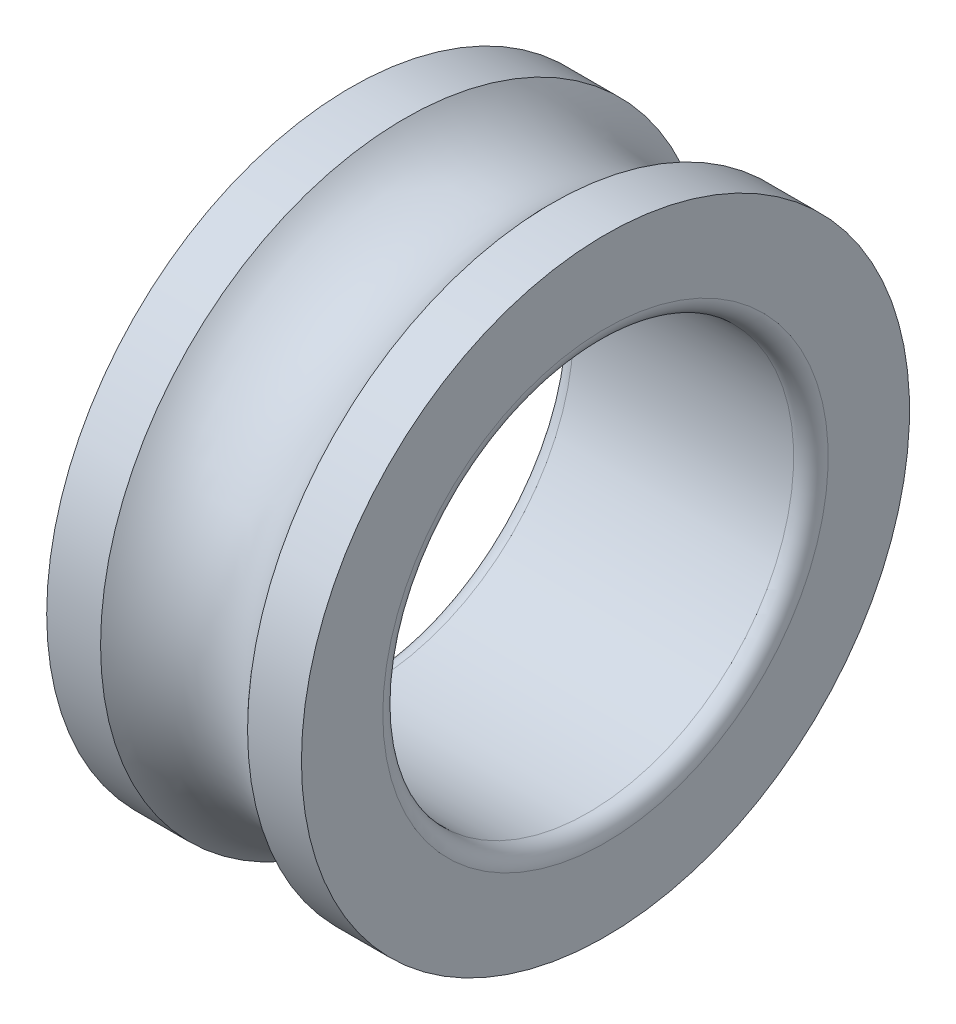
ISO-10303-21;
HEADER;
FILE_DESCRIPTION(('STEP AP214'),'2;1');
FILE_NAME('part.step','',(''),(''),'','','');
FILE_SCHEMA(('AUTOMOTIVE_DESIGN { 1 0 10303 214 1 1 1 1 }'));
ENDSEC;
DATA;
#1=APPLICATION_CONTEXT('core data for automotive mechanical design processes');
#2=APPLICATION_PROTOCOL_DEFINITION('international standard','automotive_design',2000,#1);
#3=PRODUCT_CONTEXT('',#1,'mechanical');
#4=PRODUCT('Part','Part','',(#3));
#5=PRODUCT_RELATED_PRODUCT_CATEGORY('part','',(#4));
#6=PRODUCT_DEFINITION_FORMATION('','',#4);
#7=PRODUCT_DEFINITION_CONTEXT('part definition',#1,'design');
#8=PRODUCT_DEFINITION('design','',#6,#7);
#9=PRODUCT_DEFINITION_SHAPE('','',#8);
#10=(LENGTH_UNIT() NAMED_UNIT(*) SI_UNIT(.MILLI.,.METRE.));
#11=(NAMED_UNIT(*) PLANE_ANGLE_UNIT() SI_UNIT($,.RADIAN.));
#12=(NAMED_UNIT(*) SI_UNIT($,.STERADIAN.) SOLID_ANGLE_UNIT());
#13=UNCERTAINTY_MEASURE_WITH_UNIT(LENGTH_MEASURE(1.E-05),#10,'distance_accuracy_value','');
#14=(GEOMETRIC_REPRESENTATION_CONTEXT(3) GLOBAL_UNCERTAINTY_ASSIGNED_CONTEXT((#13)) GLOBAL_UNIT_ASSIGNED_CONTEXT((#10,
#11,#12)) REPRESENTATION_CONTEXT('',''));
#15=CARTESIAN_POINT('',(0.,0.,0.));
#16=DIRECTION('',(0.,0.,1.));
#17=DIRECTION('',(1.,0.,0.));
#18=AXIS2_PLACEMENT_3D('',#15,#16,#17);
#19=CARTESIAN_POINT('',(-9.86938775510203,0.,0.));
#20=DIRECTION('',(-1.,0.,0.));
#21=DIRECTION('',(0.,0.,1.));
#22=AXIS2_PLACEMENT_3D('',#19,#20,#21);
#23=CYLINDRICAL_SURFACE('',#22,37.);
#24=CARTESIAN_POINT('',(-15.5,0.,0.));
#25=DIRECTION('',(-1.,0.,0.));
#26=DIRECTION('',(0.,0.,1.));
#27=AXIS2_PLACEMENT_3D('',#24,#25,#26);
#28=CIRCLE('',#27,37.);
#29=CARTESIAN_POINT('',(-15.5,0.,37.));
#30=VERTEX_POINT('',#29);
#31=EDGE_CURVE('E72',#30,#30,#28,.T.);
#32=ORIENTED_EDGE('',*,*,#31,.F.);
#33=EDGE_LOOP('',(#32));
#34=FACE_BOUND('',#33,.T.);
#35=CARTESIAN_POINT('',(-8.94427190999917,0.,0.));
#36=DIRECTION('',(-1.,0.,0.));
#37=DIRECTION('',(0.,0.,1.));
#38=AXIS2_PLACEMENT_3D('',#35,#36,#37);
#39=CIRCLE('',#38,37.);
#40=CARTESIAN_POINT('',(-8.94427190999917,0.,37.));
#41=VERTEX_POINT('',#40);
#42=EDGE_CURVE('E10',#41,#41,#39,.T.);
#43=ORIENTED_EDGE('',*,*,#42,.T.);
#44=EDGE_LOOP('',(#43));
#45=FACE_BOUND('',#44,.T.);
#46=ADVANCED_FACE('F37',(#34,#45),#23,.T.);
#47=CARTESIAN_POINT('',(0.,0.,0.));
#48=DIRECTION('',(-1.,0.,0.));
#49=DIRECTION('',(0.,0.,1.));
#50=AXIS2_PLACEMENT_3D('',#47,#48,#49);
#51=TOROIDAL_SURFACE('',#50,45.,12.);
#52=ORIENTED_EDGE('',*,*,#42,.F.);
#53=EDGE_LOOP('',(#52));
#54=FACE_BOUND('',#53,.T.);
#55=CARTESIAN_POINT('',(8.94427190999915,0.,0.));
#56=DIRECTION('',(-1.,0.,0.));
#57=DIRECTION('',(0.,0.,1.));
#58=AXIS2_PLACEMENT_3D('',#55,#56,#57);
#59=CIRCLE('',#58,37.);
#60=CARTESIAN_POINT('',(8.94427190999915,0.,37.));
#61=VERTEX_POINT('',#60);
#62=EDGE_CURVE('E44',#61,#61,#59,.T.);
#63=ORIENTED_EDGE('',*,*,#62,.T.);
#64=EDGE_LOOP('',(#63));
#65=FACE_BOUND('',#64,.T.);
#66=ADVANCED_FACE('F80',(#54,#65),#51,.F.);
#67=CARTESIAN_POINT('',(-9.86938775510203,0.,0.));
#68=DIRECTION('',(-1.,0.,0.));
#69=DIRECTION('',(0.,0.,1.));
#70=AXIS2_PLACEMENT_3D('',#67,#68,#69);
#71=CYLINDRICAL_SURFACE('',#70,37.);
#72=ORIENTED_EDGE('',*,*,#62,.F.);
#73=EDGE_LOOP('',(#72));
#74=FACE_BOUND('',#73,.T.);
#75=CARTESIAN_POINT('',(15.5,0.,0.));
#76=DIRECTION('',(-1.,0.,0.));
#77=DIRECTION('',(0.,0.,1.));
#78=AXIS2_PLACEMENT_3D('',#75,#76,#77);
#79=CIRCLE('',#78,37.);
#80=CARTESIAN_POINT('',(15.5,0.,37.));
#81=VERTEX_POINT('',#80);
#82=EDGE_CURVE('E49',#81,#81,#79,.T.);
#83=ORIENTED_EDGE('',*,*,#82,.T.);
#84=EDGE_LOOP('',(#83));
#85=FACE_BOUND('',#84,.T.);
#86=ADVANCED_FACE('F84',(#74,#85),#71,.T.);
#87=CARTESIAN_POINT('',(15.5,27.1,0.));
#88=DIRECTION('',(-1.,0.,0.));
#89=DIRECTION('',(0.,0.,1.));
#90=AXIS2_PLACEMENT_3D('',#87,#88,#89);
#91=PLANE('',#90);
#92=ORIENTED_EDGE('',*,*,#82,.F.);
#93=EDGE_LOOP('',(#92));
#94=FACE_BOUND('',#93,.T.);
#95=CARTESIAN_POINT('',(15.5,0.,0.));
#96=DIRECTION('',(-1.,0.,0.));
#97=DIRECTION('',(0.,0.,1.));
#98=AXIS2_PLACEMENT_3D('',#95,#96,#97);
#99=CIRCLE('',#98,27.1);
#100=CARTESIAN_POINT('',(15.5,0.,27.1));
#101=VERTEX_POINT('',#100);
#102=EDGE_CURVE('E54',#101,#101,#99,.T.);
#103=ORIENTED_EDGE('',*,*,#102,.T.);
#104=EDGE_LOOP('',(#103));
#105=FACE_BOUND('',#104,.T.);
#106=ADVANCED_FACE('F89',(#94,#105),#91,.F.);
#107=CARTESIAN_POINT('',(13.4,0.,0.));
#108=DIRECTION('',(-1.,0.,0.));
#109=DIRECTION('',(0.,0.,1.));
#110=AXIS2_PLACEMENT_3D('',#107,#108,#109);
#111=TOROIDAL_SURFACE('',#110,27.1,2.1);
#112=ORIENTED_EDGE('',*,*,#102,.F.);
#113=EDGE_LOOP('',(#112));
#114=FACE_BOUND('',#113,.T.);
#115=CARTESIAN_POINT('',(13.4,0.,0.));
#116=DIRECTION('',(-1.,0.,0.));
#117=DIRECTION('',(0.,0.,1.));
#118=AXIS2_PLACEMENT_3D('',#115,#116,#117);
#119=CIRCLE('',#118,25.);
#120=CARTESIAN_POINT('',(13.4,0.,25.));
#121=VERTEX_POINT('',#120);
#122=EDGE_CURVE('E60',#121,#121,#119,.T.);
#123=ORIENTED_EDGE('',*,*,#122,.T.);
#124=EDGE_LOOP('',(#123));
#125=FACE_BOUND('',#124,.T.);
#126=ADVANCED_FACE('F95',(#114,#125),#111,.T.);
#127=CARTESIAN_POINT('',(-9.86938775510203,0.,0.));
#128=DIRECTION('',(-1.,0.,0.));
#129=DIRECTION('',(0.,0.,1.));
#130=AXIS2_PLACEMENT_3D('',#127,#128,#129);
#131=CYLINDRICAL_SURFACE('',#130,25.);
#132=ORIENTED_EDGE('',*,*,#122,.F.);
#133=EDGE_LOOP('',(#132));
#134=FACE_BOUND('',#133,.T.);
#135=CARTESIAN_POINT('',(-13.4,0.,0.));
#136=DIRECTION('',(-1.,0.,0.));
#137=DIRECTION('',(0.,0.,1.));
#138=AXIS2_PLACEMENT_3D('',#135,#136,#137);
#139=CIRCLE('',#138,25.);
#140=CARTESIAN_POINT('',(-13.4,0.,25.));
#141=VERTEX_POINT('',#140);
#142=EDGE_CURVE('E64',#141,#141,#139,.T.);
#143=ORIENTED_EDGE('',*,*,#142,.T.);
#144=EDGE_LOOP('',(#143));
#145=FACE_BOUND('',#144,.T.);
#146=ADVANCED_FACE('F99',(#134,#145),#131,.F.);
#147=CARTESIAN_POINT('',(-13.4,0.,0.));
#148=DIRECTION('',(-1.,0.,0.));
#149=DIRECTION('',(0.,0.,1.));
#150=AXIS2_PLACEMENT_3D('',#147,#148,#149);
#151=TOROIDAL_SURFACE('',#150,27.1,2.1);
#152=ORIENTED_EDGE('',*,*,#142,.F.);
#153=EDGE_LOOP('',(#152));
#154=FACE_BOUND('',#153,.T.);
#155=CARTESIAN_POINT('',(-15.5,0.,0.));
#156=DIRECTION('',(-1.,0.,0.));
#157=DIRECTION('',(0.,0.,1.));
#158=AXIS2_PLACEMENT_3D('',#155,#156,#157);
#159=CIRCLE('',#158,27.1);
#160=CARTESIAN_POINT('',(-15.5,0.,27.1));
#161=VERTEX_POINT('',#160);
#162=EDGE_CURVE('E68',#161,#161,#159,.T.);
#163=ORIENTED_EDGE('',*,*,#162,.T.);
#164=EDGE_LOOP('',(#163));
#165=FACE_BOUND('',#164,.T.);
#166=ADVANCED_FACE('F103',(#154,#165),#151,.T.);
#167=CARTESIAN_POINT('',(-15.5,27.1,0.));
#168=DIRECTION('',(1.,0.,0.));
#169=DIRECTION('',(0.,0.,-1.));
#170=AXIS2_PLACEMENT_3D('',#167,#168,#169);
#171=PLANE('',#170);
#172=ORIENTED_EDGE('',*,*,#162,.F.);
#173=EDGE_LOOP('',(#172));
#174=FACE_BOUND('',#173,.T.);
#175=ORIENTED_EDGE('',*,*,#31,.T.);
#176=EDGE_LOOP('',(#175));
#177=FACE_BOUND('',#176,.T.);
#178=ADVANCED_FACE('F77',(#174,#177),#171,.F.);
#179=CLOSED_SHELL('',(#46,#66,#86,#106,#126,#146,#166,#178));
#180=MANIFOLD_SOLID_BREP('B2',#179);
#181=ADVANCED_BREP_SHAPE_REPRESENTATION('',(#18,#180),#14);
#182=SHAPE_DEFINITION_REPRESENTATION(#9,#181);
ENDSEC;
END-ISO-10303-21;
